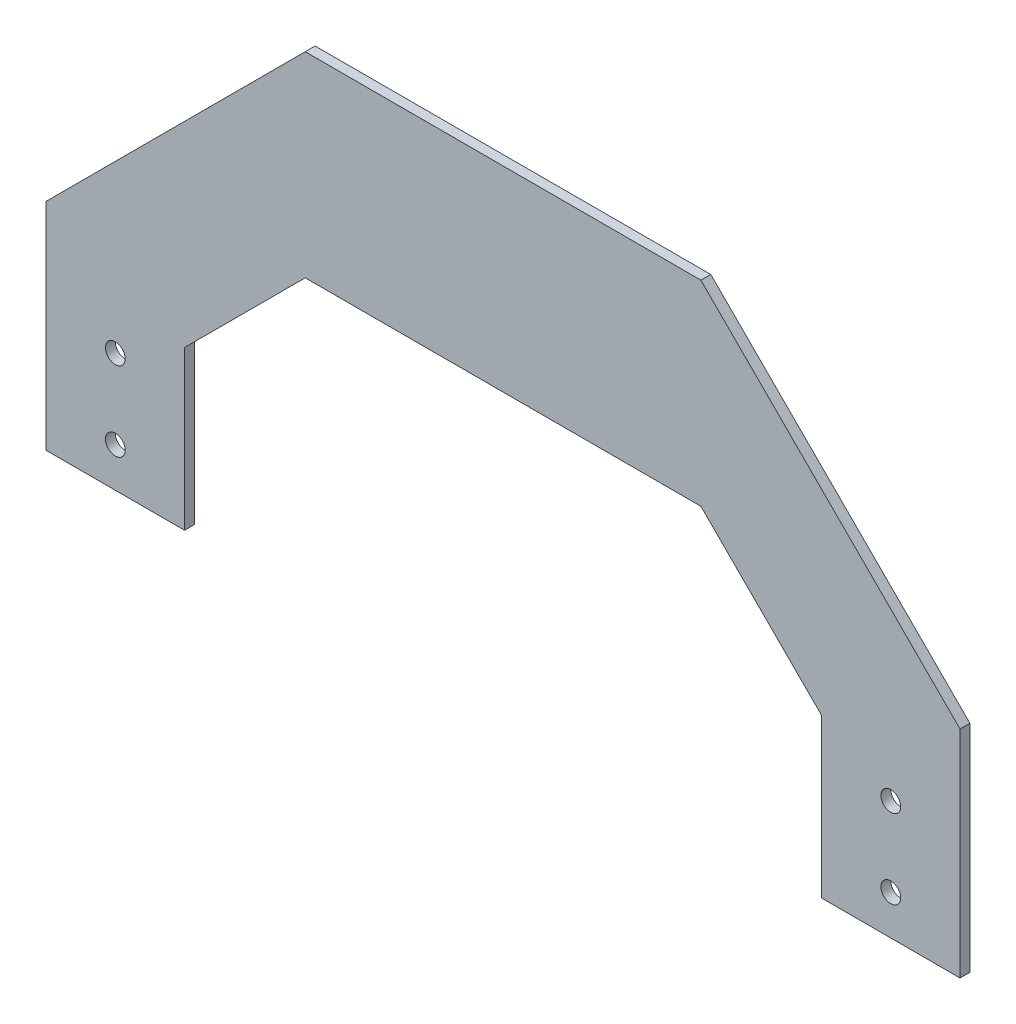
ISO-10303-21;
HEADER;
FILE_DESCRIPTION(('STEP AP214'),'2;1');
FILE_NAME('part.step','',(''),(''),'','','');
FILE_SCHEMA(('AUTOMOTIVE_DESIGN { 1 0 10303 214 1 1 1 1 }'));
ENDSEC;
DATA;
#1=APPLICATION_CONTEXT('core data for automotive mechanical design processes');
#2=APPLICATION_PROTOCOL_DEFINITION('international standard','automotive_design',2000,#1);
#3=PRODUCT_CONTEXT('',#1,'mechanical');
#4=PRODUCT('Part','Part','',(#3));
#5=PRODUCT_RELATED_PRODUCT_CATEGORY('part','',(#4));
#6=PRODUCT_DEFINITION_FORMATION('','',#4);
#7=PRODUCT_DEFINITION_CONTEXT('part definition',#1,'design');
#8=PRODUCT_DEFINITION('design','',#6,#7);
#9=PRODUCT_DEFINITION_SHAPE('','',#8);
#10=(LENGTH_UNIT() NAMED_UNIT(*) SI_UNIT(.MILLI.,.METRE.));
#11=(NAMED_UNIT(*) PLANE_ANGLE_UNIT() SI_UNIT($,.RADIAN.));
#12=(NAMED_UNIT(*) SI_UNIT($,.STERADIAN.) SOLID_ANGLE_UNIT());
#13=UNCERTAINTY_MEASURE_WITH_UNIT(LENGTH_MEASURE(1.E-05),#10,'distance_accuracy_value','');
#14=(GEOMETRIC_REPRESENTATION_CONTEXT(3) GLOBAL_UNCERTAINTY_ASSIGNED_CONTEXT((#13)) GLOBAL_UNIT_ASSIGNED_CONTEXT((#10,
#11,#12)) REPRESENTATION_CONTEXT('',''));
#15=CARTESIAN_POINT('',(0.,0.,0.));
#16=DIRECTION('',(0.,0.,1.));
#17=DIRECTION('',(1.,0.,0.));
#18=AXIS2_PLACEMENT_3D('',#15,#16,#17);
#19=CARTESIAN_POINT('',(-102.238207152516,-70.169103576258,3.175));
#20=DIRECTION('',(-1.,0.,0.));
#21=DIRECTION('',(0.,0.,1.));
#22=AXIS2_PLACEMENT_3D('',#19,#20,#21);
#23=PLANE('',#22);
#24=DIRECTION('',(0.,1.,0.));
#25=VECTOR('',#24,1.);
#26=CARTESIAN_POINT('',(-102.238207152516,-70.169103576258,0.));
#27=LINE('',#26,#25);
#28=CARTESIAN_POINT('',(-102.238207152516,-120.969103576258,0.));
#29=VERTEX_POINT('',#28);
#30=CARTESIAN_POINT('',(-102.238207152516,-70.169103576258,0.));
#31=VERTEX_POINT('',#30);
#32=EDGE_CURVE('E121',#29,#31,#27,.T.);
#33=ORIENTED_EDGE('',*,*,#32,.T.);
#34=DIRECTION('',(0.,0.,-1.));
#35=VECTOR('',#34,1.);
#36=CARTESIAN_POINT('',(-102.238207152516,-70.169103576258,3.175));
#37=LINE('',#36,#35);
#38=CARTESIAN_POINT('',(-102.238207152516,-70.169103576258,3.175));
#39=VERTEX_POINT('',#38);
#40=EDGE_CURVE('E11',#39,#31,#37,.T.);
#41=ORIENTED_EDGE('',*,*,#40,.F.);
#42=DIRECTION('',(0.,1.,0.));
#43=VECTOR('',#42,1.);
#44=CARTESIAN_POINT('',(-102.238207152516,-70.169103576258,3.175));
#45=LINE('',#44,#43);
#46=CARTESIAN_POINT('',(-102.238207152516,-120.969103576258,3.175));
#47=VERTEX_POINT('',#46);
#48=EDGE_CURVE('E135',#47,#39,#45,.T.);
#49=ORIENTED_EDGE('',*,*,#48,.F.);
#50=DIRECTION('',(0.,0.,-1.));
#51=VECTOR('',#50,1.);
#52=CARTESIAN_POINT('',(-102.238207152516,-120.969103576258,3.175));
#53=LINE('',#52,#51);
#54=EDGE_CURVE('E117',#47,#29,#53,.T.);
#55=ORIENTED_EDGE('',*,*,#54,.T.);
#56=EDGE_LOOP('',(#33,#41,#49,#55));
#57=FACE_BOUND('',#56,.T.);
#58=ADVANCED_FACE('F32',(#57),#23,.F.);
#59=CARTESIAN_POINT('',(-63.5,-31.430896423742,3.175));
#60=DIRECTION('',(-0.707106781186547,0.707106781186548,0.));
#61=DIRECTION('',(-0.707106781186548,-0.707106781186547,0.));
#62=AXIS2_PLACEMENT_3D('',#59,#60,#61);
#63=PLANE('',#62);
#64=DIRECTION('',(0.707106781186548,0.707106781186547,0.));
#65=VECTOR('',#64,1.);
#66=CARTESIAN_POINT('',(-63.5,-31.430896423742,0.));
#67=LINE('',#66,#65);
#68=CARTESIAN_POINT('',(-63.5,-31.430896423742,0.));
#69=VERTEX_POINT('',#68);
#70=EDGE_CURVE('E124',#31,#69,#67,.T.);
#71=ORIENTED_EDGE('',*,*,#70,.T.);
#72=DIRECTION('',(0.,0.,-1.));
#73=VECTOR('',#72,1.);
#74=CARTESIAN_POINT('',(-63.5,-31.430896423742,3.175));
#75=LINE('',#74,#73);
#76=CARTESIAN_POINT('',(-63.5,-31.430896423742,3.175));
#77=VERTEX_POINT('',#76);
#78=EDGE_CURVE('E40',#77,#69,#75,.T.);
#79=ORIENTED_EDGE('',*,*,#78,.F.);
#80=DIRECTION('',(0.707106781186548,0.707106781186547,0.));
#81=VECTOR('',#80,1.);
#82=CARTESIAN_POINT('',(-63.5,-31.430896423742,3.175));
#83=LINE('',#82,#81);
#84=EDGE_CURVE('E86',#39,#77,#83,.T.);
#85=ORIENTED_EDGE('',*,*,#84,.F.);
#86=ORIENTED_EDGE('',*,*,#40,.T.);
#87=EDGE_LOOP('',(#71,#79,#85,#86));
#88=FACE_BOUND('',#87,.T.);
#89=ADVANCED_FACE('F297',(#88),#63,.F.);
#90=CARTESIAN_POINT('',(-63.5,-31.430896423742,3.175));
#91=DIRECTION('',(0.,1.,0.));
#92=DIRECTION('',(-1.,0.,0.));
#93=AXIS2_PLACEMENT_3D('',#90,#91,#92);
#94=PLANE('',#93);
#95=DIRECTION('',(1.,0.,0.));
#96=VECTOR('',#95,1.);
#97=CARTESIAN_POINT('',(-63.5,-31.430896423742,0.));
#98=LINE('',#97,#96);
#99=CARTESIAN_POINT('',(63.5,-31.430896423742,0.));
#100=VERTEX_POINT('',#99);
#101=EDGE_CURVE('E127',#69,#100,#98,.T.);
#102=ORIENTED_EDGE('',*,*,#101,.T.);
#103=DIRECTION('',(0.,0.,-1.));
#104=VECTOR('',#103,1.);
#105=CARTESIAN_POINT('',(63.5,-31.430896423742,3.175));
#106=LINE('',#105,#104);
#107=CARTESIAN_POINT('',(63.5,-31.430896423742,3.175));
#108=VERTEX_POINT('',#107);
#109=EDGE_CURVE('E175',#108,#100,#106,.T.);
#110=ORIENTED_EDGE('',*,*,#109,.F.);
#111=DIRECTION('',(1.,0.,0.));
#112=VECTOR('',#111,1.);
#113=CARTESIAN_POINT('',(-63.5,-31.430896423742,3.175));
#114=LINE('',#113,#112);
#115=EDGE_CURVE('E147',#77,#108,#114,.T.);
#116=ORIENTED_EDGE('',*,*,#115,.F.);
#117=ORIENTED_EDGE('',*,*,#78,.T.);
#118=EDGE_LOOP('',(#102,#110,#116,#117));
#119=FACE_BOUND('',#118,.T.);
#120=ADVANCED_FACE('F142',(#119),#94,.F.);
#121=CARTESIAN_POINT('',(-63.5,31.430896423742,3.175));
#122=DIRECTION('',(0.,-1.,0.));
#123=DIRECTION('',(1.,0.,0.));
#124=AXIS2_PLACEMENT_3D('',#121,#122,#123);
#125=PLANE('',#124);
#126=DIRECTION('',(-1.,0.,0.));
#127=VECTOR('',#126,1.);
#128=CARTESIAN_POINT('',(-63.5,31.430896423742,0.));
#129=LINE('',#128,#127);
#130=CARTESIAN_POINT('',(63.5,31.430896423742,0.));
#131=VERTEX_POINT('',#130);
#132=CARTESIAN_POINT('',(-63.5,31.430896423742,0.));
#133=VERTEX_POINT('',#132);
#134=EDGE_CURVE('E130',#131,#133,#129,.T.);
#135=ORIENTED_EDGE('',*,*,#134,.T.);
#136=DIRECTION('',(0.,0.,-1.));
#137=VECTOR('',#136,1.);
#138=CARTESIAN_POINT('',(-63.5,31.430896423742,3.175));
#139=LINE('',#138,#137);
#140=CARTESIAN_POINT('',(-63.5,31.430896423742,3.175));
#141=VERTEX_POINT('',#140);
#142=EDGE_CURVE('E112',#141,#133,#139,.T.);
#143=ORIENTED_EDGE('',*,*,#142,.F.);
#144=DIRECTION('',(-1.,0.,0.));
#145=VECTOR('',#144,1.);
#146=CARTESIAN_POINT('',(-63.5,31.430896423742,3.175));
#147=LINE('',#146,#145);
#148=CARTESIAN_POINT('',(63.5,31.430896423742,3.175));
#149=VERTEX_POINT('',#148);
#150=EDGE_CURVE('E103',#149,#141,#147,.T.);
#151=ORIENTED_EDGE('',*,*,#150,.F.);
#152=DIRECTION('',(0.,0.,-1.));
#153=VECTOR('',#152,1.);
#154=CARTESIAN_POINT('',(63.5,31.430896423742,3.175));
#155=LINE('',#154,#153);
#156=EDGE_CURVE('E178',#149,#131,#155,.T.);
#157=ORIENTED_EDGE('',*,*,#156,.T.);
#158=EDGE_LOOP('',(#135,#143,#151,#157));
#159=FACE_BOUND('',#158,.T.);
#160=ADVANCED_FACE('F306',(#159),#125,.F.);
#161=CARTESIAN_POINT('',(-63.5,31.430896423742,3.175));
#162=DIRECTION('',(0.707106781186547,-0.707106781186548,0.));
#163=DIRECTION('',(0.707106781186548,0.707106781186547,0.));
#164=AXIS2_PLACEMENT_3D('',#161,#162,#163);
#165=PLANE('',#164);
#166=DIRECTION('',(-0.707106781186548,-0.707106781186547,0.));
#167=VECTOR('',#166,1.);
#168=CARTESIAN_POINT('',(-63.5,31.430896423742,0.));
#169=LINE('',#168,#167);
#170=CARTESIAN_POINT('',(-146.688207152516,-51.7573107287739,0.));
#171=VERTEX_POINT('',#170);
#172=EDGE_CURVE('E111',#133,#171,#169,.T.);
#173=ORIENTED_EDGE('',*,*,#172,.T.);
#174=DIRECTION('',(0.,0.,-1.));
#175=VECTOR('',#174,1.);
#176=CARTESIAN_POINT('',(-146.688207152516,-51.7573107287739,3.175));
#177=LINE('',#176,#175);
#178=CARTESIAN_POINT('',(-146.688207152516,-51.7573107287739,3.175));
#179=VERTEX_POINT('',#178);
#180=EDGE_CURVE('E108',#179,#171,#177,.T.);
#181=ORIENTED_EDGE('',*,*,#180,.F.);
#182=DIRECTION('',(-0.707106781186548,-0.707106781186547,0.));
#183=VECTOR('',#182,1.);
#184=CARTESIAN_POINT('',(-63.5,31.430896423742,3.175));
#185=LINE('',#184,#183);
#186=EDGE_CURVE('E96',#141,#179,#185,.T.);
#187=ORIENTED_EDGE('',*,*,#186,.F.);
#188=ORIENTED_EDGE('',*,*,#142,.T.);
#189=EDGE_LOOP('',(#173,#181,#187,#188));
#190=FACE_BOUND('',#189,.T.);
#191=ADVANCED_FACE('F109',(#190),#165,.F.);
#192=CARTESIAN_POINT('',(-146.688207152516,-51.7573107287739,3.175));
#193=DIRECTION('',(1.,0.,0.));
#194=DIRECTION('',(0.,0.,-1.));
#195=AXIS2_PLACEMENT_3D('',#192,#193,#194);
#196=PLANE('',#195);
#197=DIRECTION('',(0.,-1.,0.));
#198=VECTOR('',#197,1.);
#199=CARTESIAN_POINT('',(-146.688207152516,-51.7573107287739,0.));
#200=LINE('',#199,#198);
#201=CARTESIAN_POINT('',(-146.688207152516,-120.969103576258,0.));
#202=VERTEX_POINT('',#201);
#203=EDGE_CURVE('E72',#171,#202,#200,.T.);
#204=ORIENTED_EDGE('',*,*,#203,.T.);
#205=DIRECTION('',(0.,0.,-1.));
#206=VECTOR('',#205,1.);
#207=CARTESIAN_POINT('',(-146.688207152516,-120.969103576258,3.175));
#208=LINE('',#207,#206);
#209=CARTESIAN_POINT('',(-146.688207152516,-120.969103576258,3.175));
#210=VERTEX_POINT('',#209);
#211=EDGE_CURVE('E113',#210,#202,#208,.T.);
#212=ORIENTED_EDGE('',*,*,#211,.F.);
#213=DIRECTION('',(0.,-1.,0.));
#214=VECTOR('',#213,1.);
#215=CARTESIAN_POINT('',(-146.688207152516,-51.7573107287739,3.175));
#216=LINE('',#215,#214);
#217=EDGE_CURVE('E100',#179,#210,#216,.T.);
#218=ORIENTED_EDGE('',*,*,#217,.F.);
#219=ORIENTED_EDGE('',*,*,#180,.T.);
#220=EDGE_LOOP('',(#204,#212,#218,#219));
#221=FACE_BOUND('',#220,.T.);
#222=ADVANCED_FACE('F115',(#221),#196,.F.);
#223=CARTESIAN_POINT('',(-146.688207152516,-120.969103576258,3.175));
#224=DIRECTION('',(0.,1.,0.));
#225=DIRECTION('',(0.,0.,1.));
#226=AXIS2_PLACEMENT_3D('',#223,#224,#225);
#227=PLANE('',#226);
#228=DIRECTION('',(1.,0.,0.));
#229=VECTOR('',#228,1.);
#230=CARTESIAN_POINT('',(-146.688207152516,-120.969103576258,0.));
#231=LINE('',#230,#229);
#232=EDGE_CURVE('E78',#202,#29,#231,.T.);
#233=ORIENTED_EDGE('',*,*,#232,.T.);
#234=ORIENTED_EDGE('',*,*,#54,.F.);
#235=DIRECTION('',(1.,0.,0.));
#236=VECTOR('',#235,1.);
#237=CARTESIAN_POINT('',(-146.688207152516,-120.969103576258,3.175));
#238=LINE('',#237,#236);
#239=EDGE_CURVE('E48',#210,#47,#238,.T.);
#240=ORIENTED_EDGE('',*,*,#239,.F.);
#241=ORIENTED_EDGE('',*,*,#211,.T.);
#242=EDGE_LOOP('',(#233,#234,#240,#241));
#243=FACE_BOUND('',#242,.T.);
#244=ADVANCED_FACE('F288',(#243),#227,.F.);
#245=CARTESIAN_POINT('',(0.,0.,3.175));
#246=DIRECTION('',(0.,0.,1.));
#247=DIRECTION('',(1.,0.,0.));
#248=AXIS2_PLACEMENT_3D('',#245,#246,#247);
#249=PLANE('',#248);
#250=CARTESIAN_POINT('',(124.463207152516,-82.8691035762579,3.175));
#251=DIRECTION('',(0.,0.,-1.));
#252=DIRECTION('',(-1.,0.,0.));
#253=AXIS2_PLACEMENT_3D('',#250,#251,#252);
#254=CIRCLE('',#253,3.175);
#255=CARTESIAN_POINT('',(121.288207152516,-82.8691035762579,3.175));
#256=VERTEX_POINT('',#255);
#257=EDGE_CURVE('E262',#256,#256,#254,.T.);
#258=ORIENTED_EDGE('',*,*,#257,.T.);
#259=EDGE_LOOP('',(#258));
#260=FACE_BOUND('',#259,.T.);
#261=CARTESIAN_POINT('',(124.463207152516,-108.269103576258,3.175));
#262=DIRECTION('',(0.,0.,-1.));
#263=DIRECTION('',(-1.,0.,0.));
#264=AXIS2_PLACEMENT_3D('',#261,#262,#263);
#265=CIRCLE('',#264,3.175);
#266=CARTESIAN_POINT('',(121.288207152516,-108.269103576258,3.175));
#267=VERTEX_POINT('',#266);
#268=EDGE_CURVE('E256',#267,#267,#265,.T.);
#269=ORIENTED_EDGE('',*,*,#268,.T.);
#270=EDGE_LOOP('',(#269));
#271=FACE_BOUND('',#270,.T.);
#272=CARTESIAN_POINT('',(-124.463207152516,-82.869103576258,3.175));
#273=DIRECTION('',(0.,0.,1.));
#274=DIRECTION('',(1.,0.,0.));
#275=AXIS2_PLACEMENT_3D('',#272,#273,#274);
#276=CIRCLE('',#275,3.175);
#277=CARTESIAN_POINT('',(-121.288207152516,-82.869103576258,3.175));
#278=VERTEX_POINT('',#277);
#279=EDGE_CURVE('E190',#278,#278,#276,.T.);
#280=ORIENTED_EDGE('',*,*,#279,.F.);
#281=EDGE_LOOP('',(#280));
#282=FACE_BOUND('',#281,.T.);
#283=CARTESIAN_POINT('',(-124.463207152516,-108.269103576258,3.175));
#284=DIRECTION('',(0.,0.,1.));
#285=DIRECTION('',(1.,0.,0.));
#286=AXIS2_PLACEMENT_3D('',#283,#284,#285);
#287=CIRCLE('',#286,3.175);
#288=CARTESIAN_POINT('',(-121.288207152516,-108.269103576258,3.175));
#289=VERTEX_POINT('',#288);
#290=EDGE_CURVE('E194',#289,#289,#287,.T.);
#291=ORIENTED_EDGE('',*,*,#290,.F.);
#292=EDGE_LOOP('',(#291));
#293=FACE_BOUND('',#292,.T.);
#294=ORIENTED_EDGE('',*,*,#48,.T.);
#295=ORIENTED_EDGE('',*,*,#84,.T.);
#296=ORIENTED_EDGE('',*,*,#115,.T.);
#297=DIRECTION('',(-0.707106781186549,0.707106781186546,0.));
#298=VECTOR('',#297,1.);
#299=CARTESIAN_POINT('',(63.5,-31.430896423742,3.175));
#300=LINE('',#299,#298);
#301=CARTESIAN_POINT('',(102.238207152516,-70.1691035762579,3.175));
#302=VERTEX_POINT('',#301);
#303=EDGE_CURVE('E176',#302,#108,#300,.T.);
#304=ORIENTED_EDGE('',*,*,#303,.F.);
#305=DIRECTION('',(0.,1.,0.));
#306=VECTOR('',#305,1.);
#307=CARTESIAN_POINT('',(102.238207152516,-70.1691035762579,3.175));
#308=LINE('',#307,#306);
#309=CARTESIAN_POINT('',(102.238207152516,-120.969103576258,3.175));
#310=VERTEX_POINT('',#309);
#311=EDGE_CURVE('E161',#310,#302,#308,.T.);
#312=ORIENTED_EDGE('',*,*,#311,.F.);
#313=DIRECTION('',(-1.,0.,0.));
#314=VECTOR('',#313,1.);
#315=CARTESIAN_POINT('',(146.688207152516,-120.969103576258,3.175));
#316=LINE('',#315,#314);
#317=CARTESIAN_POINT('',(146.688207152516,-120.969103576258,3.175));
#318=VERTEX_POINT('',#317);
#319=EDGE_CURVE('E165',#318,#310,#316,.T.);
#320=ORIENTED_EDGE('',*,*,#319,.F.);
#321=DIRECTION('',(0.,-1.,0.));
#322=VECTOR('',#321,1.);
#323=CARTESIAN_POINT('',(146.688207152516,-51.7573107287738,3.175));
#324=LINE('',#323,#322);
#325=CARTESIAN_POINT('',(146.688207152516,-51.7573107287738,3.175));
#326=VERTEX_POINT('',#325);
#327=EDGE_CURVE('E213',#326,#318,#324,.T.);
#328=ORIENTED_EDGE('',*,*,#327,.F.);
#329=DIRECTION('',(0.707106781186549,-0.707106781186546,0.));
#330=VECTOR('',#329,1.);
#331=CARTESIAN_POINT('',(63.5,31.430896423742,3.175));
#332=LINE('',#331,#330);
#333=EDGE_CURVE('E210',#149,#326,#332,.T.);
#334=ORIENTED_EDGE('',*,*,#333,.F.);
#335=ORIENTED_EDGE('',*,*,#150,.T.);
#336=ORIENTED_EDGE('',*,*,#186,.T.);
#337=ORIENTED_EDGE('',*,*,#217,.T.);
#338=ORIENTED_EDGE('',*,*,#239,.T.);
#339=EDGE_LOOP('',(#294,#295,#296,#304,#312,#320,#328,#334,#335,#336,#337,#338));
#340=FACE_BOUND('',#339,.T.);
#341=ADVANCED_FACE('F98',(#260,#271,#282,#293,#340),#249,.T.);
#342=CARTESIAN_POINT('',(0.,0.,0.));
#343=DIRECTION('',(0.,0.,1.));
#344=DIRECTION('',(1.,0.,0.));
#345=AXIS2_PLACEMENT_3D('',#342,#343,#344);
#346=PLANE('',#345);
#347=CARTESIAN_POINT('',(124.463207152516,-82.8691035762579,0.));
#348=DIRECTION('',(0.,0.,-1.));
#349=DIRECTION('',(-1.,0.,0.));
#350=AXIS2_PLACEMENT_3D('',#347,#348,#349);
#351=CIRCLE('',#350,3.175);
#352=CARTESIAN_POINT('',(121.288207152516,-82.8691035762579,0.));
#353=VERTEX_POINT('',#352);
#354=EDGE_CURVE('E259',#353,#353,#351,.T.);
#355=ORIENTED_EDGE('',*,*,#354,.F.);
#356=EDGE_LOOP('',(#355));
#357=FACE_BOUND('',#356,.T.);
#358=CARTESIAN_POINT('',(124.463207152516,-108.269103576258,0.));
#359=DIRECTION('',(0.,0.,-1.));
#360=DIRECTION('',(-1.,0.,0.));
#361=AXIS2_PLACEMENT_3D('',#358,#359,#360);
#362=CIRCLE('',#361,3.175);
#363=CARTESIAN_POINT('',(121.288207152516,-108.269103576258,0.));
#364=VERTEX_POINT('',#363);
#365=EDGE_CURVE('E219',#364,#364,#362,.T.);
#366=ORIENTED_EDGE('',*,*,#365,.F.);
#367=EDGE_LOOP('',(#366));
#368=FACE_BOUND('',#367,.T.);
#369=CARTESIAN_POINT('',(-124.463207152516,-82.869103576258,0.));
#370=DIRECTION('',(0.,0.,1.));
#371=DIRECTION('',(1.,0.,0.));
#372=AXIS2_PLACEMENT_3D('',#369,#370,#371);
#373=CIRCLE('',#372,3.175);
#374=CARTESIAN_POINT('',(-121.288207152516,-82.869103576258,0.));
#375=VERTEX_POINT('',#374);
#376=EDGE_CURVE('E191',#375,#375,#373,.T.);
#377=ORIENTED_EDGE('',*,*,#376,.T.);
#378=EDGE_LOOP('',(#377));
#379=FACE_BOUND('',#378,.T.);
#380=CARTESIAN_POINT('',(-124.463207152516,-108.269103576258,0.));
#381=DIRECTION('',(0.,0.,1.));
#382=DIRECTION('',(1.,0.,0.));
#383=AXIS2_PLACEMENT_3D('',#380,#381,#382);
#384=CIRCLE('',#383,3.175);
#385=CARTESIAN_POINT('',(-121.288207152516,-108.269103576258,0.));
#386=VERTEX_POINT('',#385);
#387=EDGE_CURVE('E125',#386,#386,#384,.T.);
#388=ORIENTED_EDGE('',*,*,#387,.T.);
#389=EDGE_LOOP('',(#388));
#390=FACE_BOUND('',#389,.T.);
#391=ORIENTED_EDGE('',*,*,#32,.F.);
#392=ORIENTED_EDGE('',*,*,#232,.F.);
#393=ORIENTED_EDGE('',*,*,#203,.F.);
#394=ORIENTED_EDGE('',*,*,#172,.F.);
#395=ORIENTED_EDGE('',*,*,#134,.F.);
#396=DIRECTION('',(0.707106781186549,-0.707106781186546,0.));
#397=VECTOR('',#396,1.);
#398=CARTESIAN_POINT('',(63.5,31.430896423742,0.));
#399=LINE('',#398,#397);
#400=CARTESIAN_POINT('',(146.688207152516,-51.7573107287738,0.));
#401=VERTEX_POINT('',#400);
#402=EDGE_CURVE('E162',#131,#401,#399,.T.);
#403=ORIENTED_EDGE('',*,*,#402,.T.);
#404=DIRECTION('',(0.,-1.,0.));
#405=VECTOR('',#404,1.);
#406=CARTESIAN_POINT('',(146.688207152516,-51.7573107287738,0.));
#407=LINE('',#406,#405);
#408=CARTESIAN_POINT('',(146.688207152516,-120.969103576258,0.));
#409=VERTEX_POINT('',#408);
#410=EDGE_CURVE('E168',#401,#409,#407,.T.);
#411=ORIENTED_EDGE('',*,*,#410,.T.);
#412=DIRECTION('',(-1.,0.,0.));
#413=VECTOR('',#412,1.);
#414=CARTESIAN_POINT('',(146.688207152516,-120.969103576258,0.));
#415=LINE('',#414,#413);
#416=CARTESIAN_POINT('',(102.238207152516,-120.969103576258,0.));
#417=VERTEX_POINT('',#416);
#418=EDGE_CURVE('E218',#409,#417,#415,.T.);
#419=ORIENTED_EDGE('',*,*,#418,.T.);
#420=DIRECTION('',(0.,1.,0.));
#421=VECTOR('',#420,1.);
#422=CARTESIAN_POINT('',(102.238207152516,-70.1691035762579,0.));
#423=LINE('',#422,#421);
#424=CARTESIAN_POINT('',(102.238207152516,-70.1691035762579,0.));
#425=VERTEX_POINT('',#424);
#426=EDGE_CURVE('E157',#417,#425,#423,.T.);
#427=ORIENTED_EDGE('',*,*,#426,.T.);
#428=DIRECTION('',(-0.707106781186549,0.707106781186546,0.));
#429=VECTOR('',#428,1.);
#430=CARTESIAN_POINT('',(63.5,-31.430896423742,0.));
#431=LINE('',#430,#429);
#432=EDGE_CURVE('E154',#425,#100,#431,.T.);
#433=ORIENTED_EDGE('',*,*,#432,.T.);
#434=ORIENTED_EDGE('',*,*,#101,.F.);
#435=ORIENTED_EDGE('',*,*,#70,.F.);
#436=EDGE_LOOP('',(#391,#392,#393,#394,#395,#403,#411,#419,#427,#433,#434,#435));
#437=FACE_BOUND('',#436,.T.);
#438=ADVANCED_FACE('F151',(#357,#368,#379,#390,#437),#346,.F.);
#439=CARTESIAN_POINT('',(-124.463207152516,-108.269103576258,0.));
#440=DIRECTION('',(0.,0.,1.));
#441=DIRECTION('',(1.,0.,0.));
#442=AXIS2_PLACEMENT_3D('',#439,#440,#441);
#443=CYLINDRICAL_SURFACE('',#442,3.175);
#444=ORIENTED_EDGE('',*,*,#387,.F.);
#445=EDGE_LOOP('',(#444));
#446=FACE_BOUND('',#445,.T.);
#447=ORIENTED_EDGE('',*,*,#290,.T.);
#448=EDGE_LOOP('',(#447));
#449=FACE_BOUND('',#448,.T.);
#450=ADVANCED_FACE('F273',(#446,#449),#443,.F.);
#451=CARTESIAN_POINT('',(-124.463207152516,-82.869103576258,0.));
#452=DIRECTION('',(0.,0.,1.));
#453=DIRECTION('',(1.,0.,0.));
#454=AXIS2_PLACEMENT_3D('',#451,#452,#453);
#455=CYLINDRICAL_SURFACE('',#454,3.175);
#456=ORIENTED_EDGE('',*,*,#376,.F.);
#457=EDGE_LOOP('',(#456));
#458=FACE_BOUND('',#457,.T.);
#459=ORIENTED_EDGE('',*,*,#279,.T.);
#460=EDGE_LOOP('',(#459));
#461=FACE_BOUND('',#460,.T.);
#462=ADVANCED_FACE('F283',(#458,#461),#455,.F.);
#463=CARTESIAN_POINT('',(102.238207152516,-70.1691035762579,3.175));
#464=DIRECTION('',(-1.,0.,0.));
#465=DIRECTION('',(0.,-1.,0.));
#466=AXIS2_PLACEMENT_3D('',#463,#464,#465);
#467=PLANE('',#466);
#468=ORIENTED_EDGE('',*,*,#426,.F.);
#469=DIRECTION('',(0.,0.,-1.));
#470=VECTOR('',#469,1.);
#471=CARTESIAN_POINT('',(102.238207152516,-120.969103576258,3.175));
#472=LINE('',#471,#470);
#473=EDGE_CURVE('E187',#310,#417,#472,.T.);
#474=ORIENTED_EDGE('',*,*,#473,.F.);
#475=ORIENTED_EDGE('',*,*,#311,.T.);
#476=DIRECTION('',(0.,0.,-1.));
#477=VECTOR('',#476,1.);
#478=CARTESIAN_POINT('',(102.238207152516,-70.1691035762579,3.175));
#479=LINE('',#478,#477);
#480=EDGE_CURVE('E172',#302,#425,#479,.T.);
#481=ORIENTED_EDGE('',*,*,#480,.T.);
#482=EDGE_LOOP('',(#468,#474,#475,#481));
#483=FACE_BOUND('',#482,.T.);
#484=ADVANCED_FACE('F249',(#483),#467,.T.);
#485=CARTESIAN_POINT('',(146.688207152516,-120.969103576258,3.175));
#486=DIRECTION('',(0.,-1.,0.));
#487=DIRECTION('',(1.,0.,0.));
#488=AXIS2_PLACEMENT_3D('',#485,#486,#487);
#489=PLANE('',#488);
#490=ORIENTED_EDGE('',*,*,#418,.F.);
#491=DIRECTION('',(0.,0.,-1.));
#492=VECTOR('',#491,1.);
#493=CARTESIAN_POINT('',(146.688207152516,-120.969103576258,3.175));
#494=LINE('',#493,#492);
#495=EDGE_CURVE('E184',#318,#409,#494,.T.);
#496=ORIENTED_EDGE('',*,*,#495,.F.);
#497=ORIENTED_EDGE('',*,*,#319,.T.);
#498=ORIENTED_EDGE('',*,*,#473,.T.);
#499=EDGE_LOOP('',(#490,#496,#497,#498));
#500=FACE_BOUND('',#499,.T.);
#501=ADVANCED_FACE('F253',(#500),#489,.T.);
#502=CARTESIAN_POINT('',(146.688207152516,-51.7573107287738,3.175));
#503=DIRECTION('',(1.,0.,0.));
#504=DIRECTION('',(0.,1.,0.));
#505=AXIS2_PLACEMENT_3D('',#502,#503,#504);
#506=PLANE('',#505);
#507=ORIENTED_EDGE('',*,*,#410,.F.);
#508=DIRECTION('',(0.,0.,-1.));
#509=VECTOR('',#508,1.);
#510=CARTESIAN_POINT('',(146.688207152516,-51.7573107287738,3.175));
#511=LINE('',#510,#509);
#512=EDGE_CURVE('E181',#326,#401,#511,.T.);
#513=ORIENTED_EDGE('',*,*,#512,.F.);
#514=ORIENTED_EDGE('',*,*,#327,.T.);
#515=ORIENTED_EDGE('',*,*,#495,.T.);
#516=EDGE_LOOP('',(#507,#513,#514,#515));
#517=FACE_BOUND('',#516,.T.);
#518=ADVANCED_FACE('F231',(#517),#506,.T.);
#519=CARTESIAN_POINT('',(63.5,31.430896423742,3.175));
#520=DIRECTION('',(0.707106781186546,0.707106781186549,0.));
#521=DIRECTION('',(-0.707106781186549,0.707106781186546,0.));
#522=AXIS2_PLACEMENT_3D('',#519,#520,#521);
#523=PLANE('',#522);
#524=ORIENTED_EDGE('',*,*,#402,.F.);
#525=ORIENTED_EDGE('',*,*,#156,.F.);
#526=ORIENTED_EDGE('',*,*,#333,.T.);
#527=ORIENTED_EDGE('',*,*,#512,.T.);
#528=EDGE_LOOP('',(#524,#525,#526,#527));
#529=FACE_BOUND('',#528,.T.);
#530=ADVANCED_FACE('F307',(#529),#523,.T.);
#531=CARTESIAN_POINT('',(63.5,-31.430896423742,3.175));
#532=DIRECTION('',(-0.707106781186546,-0.707106781186549,0.));
#533=DIRECTION('',(0.707106781186549,-0.707106781186546,0.));
#534=AXIS2_PLACEMENT_3D('',#531,#532,#533);
#535=PLANE('',#534);
#536=ORIENTED_EDGE('',*,*,#432,.F.);
#537=ORIENTED_EDGE('',*,*,#480,.F.);
#538=ORIENTED_EDGE('',*,*,#303,.T.);
#539=ORIENTED_EDGE('',*,*,#109,.T.);
#540=EDGE_LOOP('',(#536,#537,#538,#539));
#541=FACE_BOUND('',#540,.T.);
#542=ADVANCED_FACE('F209',(#541),#535,.T.);
#543=CARTESIAN_POINT('',(124.463207152516,-108.269103576258,0.));
#544=DIRECTION('',(0.,0.,1.));
#545=DIRECTION('',(1.,0.,0.));
#546=AXIS2_PLACEMENT_3D('',#543,#544,#545);
#547=CYLINDRICAL_SURFACE('',#546,3.175);
#548=ORIENTED_EDGE('',*,*,#365,.T.);
#549=EDGE_LOOP('',(#548));
#550=FACE_BOUND('',#549,.T.);
#551=ORIENTED_EDGE('',*,*,#268,.F.);
#552=EDGE_LOOP('',(#551));
#553=FACE_BOUND('',#552,.T.);
#554=ADVANCED_FACE('F314',(#550,#553),#547,.F.);
#555=CARTESIAN_POINT('',(124.463207152516,-82.8691035762579,0.));
#556=DIRECTION('',(0.,0.,1.));
#557=DIRECTION('',(1.,0.,0.));
#558=AXIS2_PLACEMENT_3D('',#555,#556,#557);
#559=CYLINDRICAL_SURFACE('',#558,3.175);
#560=ORIENTED_EDGE('',*,*,#354,.T.);
#561=EDGE_LOOP('',(#560));
#562=FACE_BOUND('',#561,.T.);
#563=ORIENTED_EDGE('',*,*,#257,.F.);
#564=EDGE_LOOP('',(#563));
#565=FACE_BOUND('',#564,.T.);
#566=ADVANCED_FACE('F268',(#562,#565),#559,.F.);
#567=CLOSED_SHELL('',(#58,#89,#120,#160,#191,#222,#244,#341,#438,#450,#462,#484,#501,#518,#530,
#542,#554,#566));
#568=MANIFOLD_SOLID_BREP('B2',#567);
#569=ADVANCED_BREP_SHAPE_REPRESENTATION('',(#18,#568),#14);
#570=SHAPE_DEFINITION_REPRESENTATION(#9,#569);
ENDSEC;
END-ISO-10303-21;
